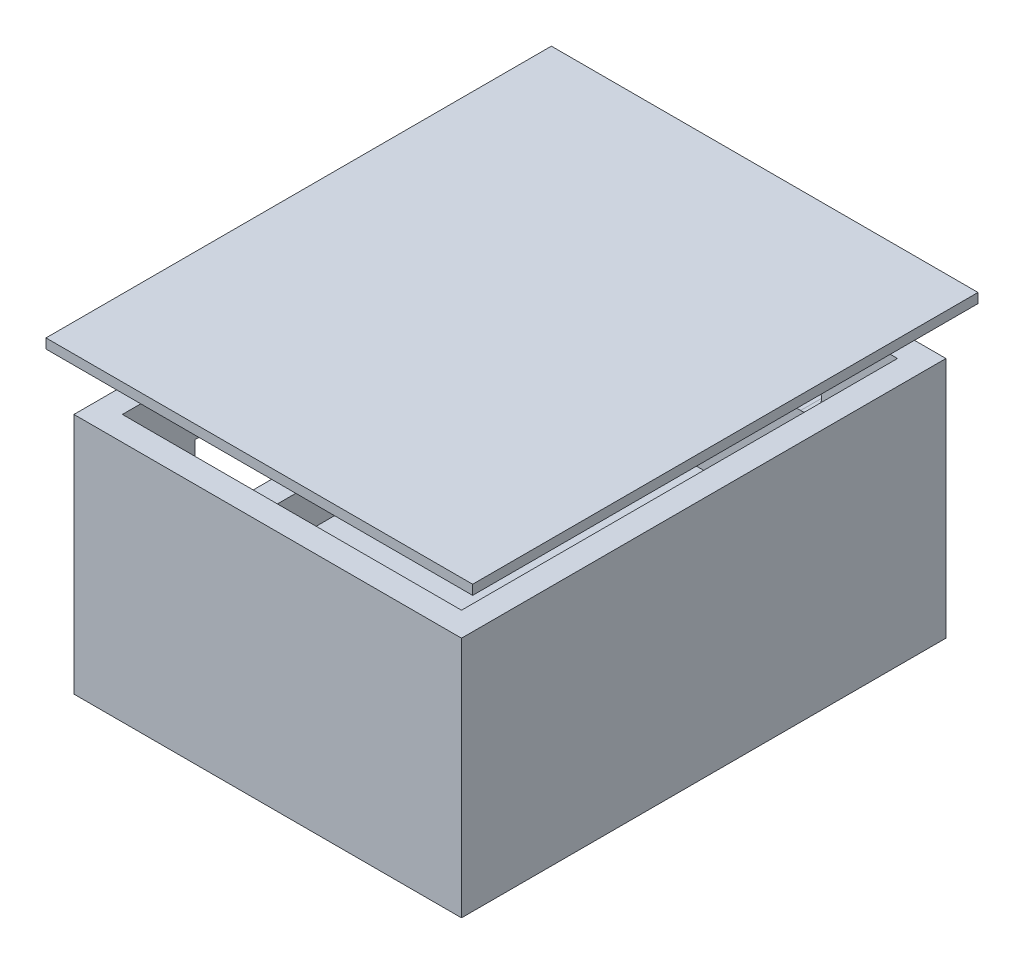
ISO-10303-21;
HEADER;
FILE_DESCRIPTION(('STEP AP214'),'2;1');
FILE_NAME('part.step','',(''),(''),'','','');
FILE_SCHEMA(('AUTOMOTIVE_DESIGN { 1 0 10303 214 1 1 1 1 }'));
ENDSEC;
DATA;
#1=APPLICATION_CONTEXT('core data for automotive mechanical design processes');
#2=APPLICATION_PROTOCOL_DEFINITION('international standard','automotive_design',2000,#1);
#3=PRODUCT_CONTEXT('',#1,'mechanical');
#4=PRODUCT('Part','Part','',(#3));
#5=PRODUCT_RELATED_PRODUCT_CATEGORY('part','',(#4));
#6=PRODUCT_DEFINITION_FORMATION('','',#4);
#7=PRODUCT_DEFINITION_CONTEXT('part definition',#1,'design');
#8=PRODUCT_DEFINITION('design','',#6,#7);
#9=PRODUCT_DEFINITION_SHAPE('','',#8);
#10=(LENGTH_UNIT() NAMED_UNIT(*) SI_UNIT(.MILLI.,.METRE.));
#11=(NAMED_UNIT(*) PLANE_ANGLE_UNIT() SI_UNIT($,.RADIAN.));
#12=(NAMED_UNIT(*) SI_UNIT($,.STERADIAN.) SOLID_ANGLE_UNIT());
#13=UNCERTAINTY_MEASURE_WITH_UNIT(LENGTH_MEASURE(1.E-05),#10,'distance_accuracy_value','');
#14=(GEOMETRIC_REPRESENTATION_CONTEXT(3) GLOBAL_UNCERTAINTY_ASSIGNED_CONTEXT((#13)) GLOBAL_UNIT_ASSIGNED_CONTEXT((#10,
#11,#12)) REPRESENTATION_CONTEXT('',''));
#15=CARTESIAN_POINT('',(0.,0.,0.));
#16=DIRECTION('',(0.,0.,1.));
#17=DIRECTION('',(1.,0.,0.));
#18=AXIS2_PLACEMENT_3D('',#15,#16,#17);
#19=CARTESIAN_POINT('',(0.,76.2,0.));
#20=DIRECTION('',(0.,-1.,0.));
#21=DIRECTION('',(0.,0.,-1.));
#22=AXIS2_PLACEMENT_3D('',#19,#20,#21);
#23=PLANE('',#22);
#24=DIRECTION('',(0.,0.,-1.));
#25=VECTOR('',#24,1.);
#26=CARTESIAN_POINT('',(106.04728817998,76.2,-130.953861718467));
#27=LINE('',#26,#25);
#28=CARTESIAN_POINT('',(106.04728817998,76.2,1.52858818137247));
#29=VERTEX_POINT('',#28);
#30=CARTESIAN_POINT('',(106.04728817998,76.2,-130.953861718467));
#31=VERTEX_POINT('',#30);
#32=EDGE_CURVE('E149',#29,#31,#27,.T.);
#33=ORIENTED_EDGE('',*,*,#32,.F.);
#34=DIRECTION('',(1.,0.,0.));
#35=VECTOR('',#34,1.);
#36=CARTESIAN_POINT('',(106.04728817998,76.2,1.52858818137247));
#37=LINE('',#36,#35);
#38=CARTESIAN_POINT('',(-5.79709493342762,76.2,1.52858818137247));
#39=VERTEX_POINT('',#38);
#40=EDGE_CURVE('E157',#39,#29,#37,.T.);
#41=ORIENTED_EDGE('',*,*,#40,.F.);
#42=DIRECTION('',(0.,0.,1.));
#43=VECTOR('',#42,1.);
#44=CARTESIAN_POINT('',(-5.79709493342762,76.2,-130.953861718467));
#45=LINE('',#44,#43);
#46=CARTESIAN_POINT('',(-5.79709493342762,76.2,-130.953861718467));
#47=VERTEX_POINT('',#46);
#48=EDGE_CURVE('E154',#47,#39,#45,.T.);
#49=ORIENTED_EDGE('',*,*,#48,.F.);
#50=DIRECTION('',(-1.,0.,0.));
#51=VECTOR('',#50,1.);
#52=CARTESIAN_POINT('',(106.04728817998,76.2,-130.953861718467));
#53=LINE('',#52,#51);
#54=EDGE_CURVE('E151',#31,#47,#53,.T.);
#55=ORIENTED_EDGE('',*,*,#54,.F.);
#56=EDGE_LOOP('',(#33,#41,#49,#55));
#57=FACE_BOUND('',#56,.T.);
#58=DIRECTION('',(0.,0.,1.));
#59=VECTOR('',#58,1.);
#60=CARTESIAN_POINT('',(99.1892881799797,76.2,-124.095861718467));
#61=LINE('',#60,#59);
#62=CARTESIAN_POINT('',(99.1892881799797,76.2,-124.095861718467));
#63=VERTEX_POINT('',#62);
#64=CARTESIAN_POINT('',(99.1892881799797,76.2,-5.32941181862753));
#65=VERTEX_POINT('',#64);
#66=EDGE_CURVE('E181',#63,#65,#61,.T.);
#67=ORIENTED_EDGE('',*,*,#66,.F.);
#68=DIRECTION('',(1.,0.,0.));
#69=VECTOR('',#68,1.);
#70=CARTESIAN_POINT('',(1.06090506657238,76.2,-124.095861718467));
#71=LINE('',#70,#69);
#72=CARTESIAN_POINT('',(1.06090506657238,76.2,-124.095861718467));
#73=VERTEX_POINT('',#72);
#74=EDGE_CURVE('E139',#73,#63,#71,.T.);
#75=ORIENTED_EDGE('',*,*,#74,.F.);
#76=DIRECTION('',(0.,0.,-1.));
#77=VECTOR('',#76,1.);
#78=CARTESIAN_POINT('',(1.06090506657238,76.2,-5.32941181862753));
#79=LINE('',#78,#77);
#80=CARTESIAN_POINT('',(1.06090506657238,76.2,-5.32941181862753));
#81=VERTEX_POINT('',#80);
#82=EDGE_CURVE('E135',#81,#73,#79,.T.);
#83=ORIENTED_EDGE('',*,*,#82,.F.);
#84=DIRECTION('',(-1.,0.,0.));
#85=VECTOR('',#84,1.);
#86=CARTESIAN_POINT('',(99.1892881799797,76.2,-5.32941181862753));
#87=LINE('',#86,#85);
#88=EDGE_CURVE('E183',#65,#81,#87,.T.);
#89=ORIENTED_EDGE('',*,*,#88,.F.);
#90=EDGE_LOOP('',(#67,#75,#83,#89));
#91=FACE_BOUND('',#90,.T.);
#92=ADVANCED_FACE('F43',(#57,#91),#23,.T.);
#93=CARTESIAN_POINT('',(106.04728817998,76.2,-130.953861718467));
#94=DIRECTION('',(1.,0.,0.));
#95=DIRECTION('',(0.,0.,-1.));
#96=AXIS2_PLACEMENT_3D('',#93,#94,#95);
#97=PLANE('',#96);
#98=DIRECTION('',(0.,0.,-1.));
#99=VECTOR('',#98,1.);
#100=CARTESIAN_POINT('',(106.04728817998,78.74,-130.953861718467));
#101=LINE('',#100,#99);
#102=CARTESIAN_POINT('',(106.04728817998,78.74,1.52858818137247));
#103=VERTEX_POINT('',#102);
#104=CARTESIAN_POINT('',(106.04728817998,78.74,-130.953861718467));
#105=VERTEX_POINT('',#104);
#106=EDGE_CURVE('E141',#103,#105,#101,.T.);
#107=ORIENTED_EDGE('',*,*,#106,.F.);
#108=DIRECTION('',(0.,1.,0.));
#109=VECTOR('',#108,1.);
#110=CARTESIAN_POINT('',(106.04728817998,76.2,1.52858818137247));
#111=LINE('',#110,#109);
#112=EDGE_CURVE('E12',#29,#103,#111,.T.);
#113=ORIENTED_EDGE('',*,*,#112,.F.);
#114=ORIENTED_EDGE('',*,*,#32,.T.);
#115=DIRECTION('',(0.,1.,0.));
#116=VECTOR('',#115,1.);
#117=CARTESIAN_POINT('',(106.04728817998,76.2,-130.953861718467));
#118=LINE('',#117,#116);
#119=EDGE_CURVE('E47',#31,#105,#118,.T.);
#120=ORIENTED_EDGE('',*,*,#119,.T.);
#121=EDGE_LOOP('',(#107,#113,#114,#120));
#122=FACE_BOUND('',#121,.T.);
#123=ADVANCED_FACE('F45',(#122),#97,.T.);
#124=CARTESIAN_POINT('',(106.04728817998,76.2,1.52858818137247));
#125=DIRECTION('',(0.,0.,1.));
#126=DIRECTION('',(1.,0.,0.));
#127=AXIS2_PLACEMENT_3D('',#124,#125,#126);
#128=PLANE('',#127);
#129=DIRECTION('',(1.,0.,0.));
#130=VECTOR('',#129,1.);
#131=CARTESIAN_POINT('',(106.04728817998,78.74,1.52858818137247));
#132=LINE('',#131,#130);
#133=CARTESIAN_POINT('',(-5.79709493342762,78.74,1.52858818137247));
#134=VERTEX_POINT('',#133);
#135=EDGE_CURVE('E152',#134,#103,#132,.T.);
#136=ORIENTED_EDGE('',*,*,#135,.F.);
#137=DIRECTION('',(0.,1.,0.));
#138=VECTOR('',#137,1.);
#139=CARTESIAN_POINT('',(-5.79709493342762,76.2,1.52858818137247));
#140=LINE('',#139,#138);
#141=EDGE_CURVE('E52',#39,#134,#140,.T.);
#142=ORIENTED_EDGE('',*,*,#141,.F.);
#143=ORIENTED_EDGE('',*,*,#40,.T.);
#144=ORIENTED_EDGE('',*,*,#112,.T.);
#145=EDGE_LOOP('',(#136,#142,#143,#144));
#146=FACE_BOUND('',#145,.T.);
#147=ADVANCED_FACE('F171',(#146),#128,.T.);
#148=CARTESIAN_POINT('',(-5.79709493342762,76.2,-130.953861718467));
#149=DIRECTION('',(-1.,0.,0.));
#150=DIRECTION('',(0.,0.,1.));
#151=AXIS2_PLACEMENT_3D('',#148,#149,#150);
#152=PLANE('',#151);
#153=DIRECTION('',(0.,0.,1.));
#154=VECTOR('',#153,1.);
#155=CARTESIAN_POINT('',(-5.79709493342762,78.74,-130.953861718467));
#156=LINE('',#155,#154);
#157=CARTESIAN_POINT('',(-5.79709493342762,78.74,-130.953861718467));
#158=VERTEX_POINT('',#157);
#159=EDGE_CURVE('E161',#158,#134,#156,.T.);
#160=ORIENTED_EDGE('',*,*,#159,.F.);
#161=DIRECTION('',(0.,1.,0.));
#162=VECTOR('',#161,1.);
#163=CARTESIAN_POINT('',(-5.79709493342762,76.2,-130.953861718467));
#164=LINE('',#163,#162);
#165=EDGE_CURVE('E166',#47,#158,#164,.T.);
#166=ORIENTED_EDGE('',*,*,#165,.F.);
#167=ORIENTED_EDGE('',*,*,#48,.T.);
#168=ORIENTED_EDGE('',*,*,#141,.T.);
#169=EDGE_LOOP('',(#160,#166,#167,#168));
#170=FACE_BOUND('',#169,.T.);
#171=ADVANCED_FACE('F175',(#170),#152,.T.);
#172=CARTESIAN_POINT('',(106.04728817998,76.2,-130.953861718467));
#173=DIRECTION('',(0.,0.,-1.));
#174=DIRECTION('',(-1.,0.,0.));
#175=AXIS2_PLACEMENT_3D('',#172,#173,#174);
#176=PLANE('',#175);
#177=DIRECTION('',(-1.,0.,0.));
#178=VECTOR('',#177,1.);
#179=CARTESIAN_POINT('',(106.04728817998,78.74,-130.953861718467));
#180=LINE('',#179,#178);
#181=EDGE_CURVE('E144',#105,#158,#180,.T.);
#182=ORIENTED_EDGE('',*,*,#181,.F.);
#183=ORIENTED_EDGE('',*,*,#119,.F.);
#184=ORIENTED_EDGE('',*,*,#54,.T.);
#185=ORIENTED_EDGE('',*,*,#165,.T.);
#186=EDGE_LOOP('',(#182,#183,#184,#185));
#187=FACE_BOUND('',#186,.T.);
#188=ADVANCED_FACE('F168',(#187),#176,.T.);
#189=CARTESIAN_POINT('',(0.,78.74,0.));
#190=DIRECTION('',(0.,-1.,0.));
#191=DIRECTION('',(0.,0.,-1.));
#192=AXIS2_PLACEMENT_3D('',#189,#190,#191);
#193=PLANE('',#192);
#194=ORIENTED_EDGE('',*,*,#106,.T.);
#195=ORIENTED_EDGE('',*,*,#181,.T.);
#196=ORIENTED_EDGE('',*,*,#159,.T.);
#197=ORIENTED_EDGE('',*,*,#135,.T.);
#198=EDGE_LOOP('',(#194,#195,#196,#197));
#199=FACE_BOUND('',#198,.T.);
#200=ADVANCED_FACE('F170',(#199),#193,.F.);
#201=CARTESIAN_POINT('',(1.06090506657238,73.66,-124.095861718467));
#202=DIRECTION('',(0.,0.,1.));
#203=DIRECTION('',(1.,0.,0.));
#204=AXIS2_PLACEMENT_3D('',#201,#202,#203);
#205=PLANE('',#204);
#206=ORIENTED_EDGE('',*,*,#74,.T.);
#207=DIRECTION('',(0.,1.,0.));
#208=VECTOR('',#207,1.);
#209=CARTESIAN_POINT('',(99.1892881799797,73.66,-124.095861718467));
#210=LINE('',#209,#208);
#211=CARTESIAN_POINT('',(99.1892881799797,73.66,-124.095861718467));
#212=VERTEX_POINT('',#211);
#213=EDGE_CURVE('E120',#212,#63,#210,.T.);
#214=ORIENTED_EDGE('',*,*,#213,.F.);
#215=DIRECTION('',(1.,0.,0.));
#216=VECTOR('',#215,1.);
#217=CARTESIAN_POINT('',(1.06090506657238,73.66,-124.095861718467));
#218=LINE('',#217,#216);
#219=CARTESIAN_POINT('',(1.06090506657238,73.66,-124.095861718467));
#220=VERTEX_POINT('',#219);
#221=EDGE_CURVE('E127',#220,#212,#218,.T.);
#222=ORIENTED_EDGE('',*,*,#221,.F.);
#223=DIRECTION('',(0.,1.,0.));
#224=VECTOR('',#223,1.);
#225=CARTESIAN_POINT('',(1.06090506657238,73.66,-124.095861718467));
#226=LINE('',#225,#224);
#227=EDGE_CURVE('E190',#220,#73,#226,.T.);
#228=ORIENTED_EDGE('',*,*,#227,.T.);
#229=EDGE_LOOP('',(#206,#214,#222,#228));
#230=FACE_BOUND('',#229,.T.);
#231=ADVANCED_FACE('F137',(#230),#205,.F.);
#232=CARTESIAN_POINT('',(99.1892881799797,73.66,-124.095861718467));
#233=DIRECTION('',(-1.,0.,0.));
#234=DIRECTION('',(0.,0.,1.));
#235=AXIS2_PLACEMENT_3D('',#232,#233,#234);
#236=PLANE('',#235);
#237=ORIENTED_EDGE('',*,*,#66,.T.);
#238=DIRECTION('',(0.,1.,0.));
#239=VECTOR('',#238,1.);
#240=CARTESIAN_POINT('',(99.1892881799797,73.66,-5.32941181862753));
#241=LINE('',#240,#239);
#242=CARTESIAN_POINT('',(99.1892881799797,73.66,-5.32941181862753));
#243=VERTEX_POINT('',#242);
#244=EDGE_CURVE('E123',#243,#65,#241,.T.);
#245=ORIENTED_EDGE('',*,*,#244,.F.);
#246=DIRECTION('',(0.,0.,1.));
#247=VECTOR('',#246,1.);
#248=CARTESIAN_POINT('',(99.1892881799797,73.66,-124.095861718467));
#249=LINE('',#248,#247);
#250=EDGE_CURVE('E116',#212,#243,#249,.T.);
#251=ORIENTED_EDGE('',*,*,#250,.F.);
#252=ORIENTED_EDGE('',*,*,#213,.T.);
#253=EDGE_LOOP('',(#237,#245,#251,#252));
#254=FACE_BOUND('',#253,.T.);
#255=ADVANCED_FACE('F118',(#254),#236,.F.);
#256=CARTESIAN_POINT('',(99.1892881799797,73.66,-5.32941181862753));
#257=DIRECTION('',(0.,0.,-1.));
#258=DIRECTION('',(-1.,0.,0.));
#259=AXIS2_PLACEMENT_3D('',#256,#257,#258);
#260=PLANE('',#259);
#261=ORIENTED_EDGE('',*,*,#88,.T.);
#262=DIRECTION('',(0.,1.,0.));
#263=VECTOR('',#262,1.);
#264=CARTESIAN_POINT('',(1.06090506657238,73.66,-5.32941181862753));
#265=LINE('',#264,#263);
#266=CARTESIAN_POINT('',(1.06090506657238,73.66,-5.32941181862753));
#267=VERTEX_POINT('',#266);
#268=EDGE_CURVE('E60',#267,#81,#265,.T.);
#269=ORIENTED_EDGE('',*,*,#268,.F.);
#270=DIRECTION('',(-1.,0.,0.));
#271=VECTOR('',#270,1.);
#272=CARTESIAN_POINT('',(99.1892881799797,73.66,-5.32941181862753));
#273=LINE('',#272,#271);
#274=EDGE_CURVE('E126',#243,#267,#273,.T.);
#275=ORIENTED_EDGE('',*,*,#274,.F.);
#276=ORIENTED_EDGE('',*,*,#244,.T.);
#277=EDGE_LOOP('',(#261,#269,#275,#276));
#278=FACE_BOUND('',#277,.T.);
#279=ADVANCED_FACE('F193',(#278),#260,.F.);
#280=CARTESIAN_POINT('',(1.06090506657238,73.66,-5.32941181862753));
#281=DIRECTION('',(1.,0.,0.));
#282=DIRECTION('',(0.,0.,-1.));
#283=AXIS2_PLACEMENT_3D('',#280,#281,#282);
#284=PLANE('',#283);
#285=ORIENTED_EDGE('',*,*,#82,.T.);
#286=ORIENTED_EDGE('',*,*,#227,.F.);
#287=DIRECTION('',(0.,0.,-1.));
#288=VECTOR('',#287,1.);
#289=CARTESIAN_POINT('',(1.06090506657238,73.66,-5.32941181862753));
#290=LINE('',#289,#288);
#291=EDGE_CURVE('E131',#267,#220,#290,.T.);
#292=ORIENTED_EDGE('',*,*,#291,.F.);
#293=ORIENTED_EDGE('',*,*,#268,.T.);
#294=EDGE_LOOP('',(#285,#286,#292,#293));
#295=FACE_BOUND('',#294,.T.);
#296=ADVANCED_FACE('F194',(#295),#284,.F.);
#297=CARTESIAN_POINT('',(0.,73.66,0.));
#298=DIRECTION('',(0.,-1.,0.));
#299=DIRECTION('',(0.,0.,-1.));
#300=AXIS2_PLACEMENT_3D('',#297,#298,#299);
#301=PLANE('',#300);
#302=ORIENTED_EDGE('',*,*,#221,.T.);
#303=ORIENTED_EDGE('',*,*,#250,.T.);
#304=ORIENTED_EDGE('',*,*,#274,.T.);
#305=ORIENTED_EDGE('',*,*,#291,.T.);
#306=EDGE_LOOP('',(#302,#303,#304,#305));
#307=FACE_BOUND('',#306,.T.);
#308=ADVANCED_FACE('F130',(#307),#301,.T.);
#309=CLOSED_SHELL('',(#92,#123,#147,#171,#188,#200,#231,#255,#279,#296,#308));
#310=MANIFOLD_SOLID_BREP('B2',#309);
#311=CARTESIAN_POINT('',(0.,63.5,0.));
#312=DIRECTION('',(1.,0.,0.));
#313=DIRECTION('',(0.,0.,-1.));
#314=AXIS2_PLACEMENT_3D('',#311,#312,#313);
#315=PLANE('',#314);
#316=DIRECTION('',(0.,0.,-1.));
#317=VECTOR('',#316,1.);
#318=CARTESIAN_POINT('',(0.,48.26,-101.6));
#319=LINE('',#318,#317);
#320=CARTESIAN_POINT('',(0.,48.26,-25.4));
#321=VERTEX_POINT('',#320);
#322=CARTESIAN_POINT('',(0.,48.26,-101.6));
#323=VERTEX_POINT('',#322);
#324=EDGE_CURVE('E424',#321,#323,#319,.T.);
#325=ORIENTED_EDGE('',*,*,#324,.F.);
#326=DIRECTION('',(0.,1.,0.));
#327=VECTOR('',#326,1.);
#328=CARTESIAN_POINT('',(0.,48.26,-25.4));
#329=LINE('',#328,#327);
#330=CARTESIAN_POINT('',(0.,22.86,-25.4));
#331=VERTEX_POINT('',#330);
#332=EDGE_CURVE('E420',#331,#321,#329,.T.);
#333=ORIENTED_EDGE('',*,*,#332,.F.);
#334=DIRECTION('',(0.,0.,1.));
#335=VECTOR('',#334,1.);
#336=CARTESIAN_POINT('',(0.,22.86,-25.4));
#337=LINE('',#336,#335);
#338=CARTESIAN_POINT('',(0.,22.86,-101.6));
#339=VERTEX_POINT('',#338);
#340=EDGE_CURVE('E430',#339,#331,#337,.T.);
#341=ORIENTED_EDGE('',*,*,#340,.F.);
#342=DIRECTION('',(0.,-1.,0.));
#343=VECTOR('',#342,1.);
#344=CARTESIAN_POINT('',(0.,48.26,-101.6));
#345=LINE('',#344,#343);
#346=EDGE_CURVE('E427',#323,#339,#345,.T.);
#347=ORIENTED_EDGE('',*,*,#346,.F.);
#348=EDGE_LOOP('',(#325,#333,#341,#347));
#349=FACE_BOUND('',#348,.T.);
#350=DIRECTION('',(0.,0.,1.));
#351=VECTOR('',#350,1.);
#352=CARTESIAN_POINT('',(0.,0.,0.));
#353=LINE('',#352,#351);
#354=CARTESIAN_POINT('',(0.,0.,-127.));
#355=VERTEX_POINT('',#354);
#356=CARTESIAN_POINT('',(0.,0.,0.));
#357=VERTEX_POINT('',#356);
#358=EDGE_CURVE('E468',#355,#357,#353,.T.);
#359=ORIENTED_EDGE('',*,*,#358,.T.);
#360=DIRECTION('',(0.,-1.,0.));
#361=VECTOR('',#360,1.);
#362=CARTESIAN_POINT('',(0.,63.5,0.));
#363=LINE('',#362,#361);
#364=CARTESIAN_POINT('',(0.,63.5,0.));
#365=VERTEX_POINT('',#364);
#366=EDGE_CURVE('E501',#365,#357,#363,.T.);
#367=ORIENTED_EDGE('',*,*,#366,.F.);
#368=DIRECTION('',(0.,0.,1.));
#369=VECTOR('',#368,1.);
#370=CARTESIAN_POINT('',(0.,63.5,0.));
#371=LINE('',#370,#369);
#372=CARTESIAN_POINT('',(0.,63.5,-127.));
#373=VERTEX_POINT('',#372);
#374=EDGE_CURVE('E475',#373,#365,#371,.T.);
#375=ORIENTED_EDGE('',*,*,#374,.F.);
#376=DIRECTION('',(0.,-1.,0.));
#377=VECTOR('',#376,1.);
#378=CARTESIAN_POINT('',(0.,63.5,-127.));
#379=LINE('',#378,#377);
#380=EDGE_CURVE('E485',#373,#355,#379,.T.);
#381=ORIENTED_EDGE('',*,*,#380,.T.);
#382=EDGE_LOOP('',(#359,#367,#375,#381));
#383=FACE_BOUND('',#382,.T.);
#384=ADVANCED_FACE('F282',(#349,#383),#315,.F.);
#385=CARTESIAN_POINT('',(0.,63.5,0.));
#386=DIRECTION('',(0.,0.,-1.));
#387=DIRECTION('',(-1.,0.,0.));
#388=AXIS2_PLACEMENT_3D('',#385,#386,#387);
#389=PLANE('',#388);
#390=DIRECTION('',(1.,0.,0.));
#391=VECTOR('',#390,1.);
#392=CARTESIAN_POINT('',(0.,0.,0.));
#393=LINE('',#392,#391);
#394=CARTESIAN_POINT('',(101.6,0.,0.));
#395=VERTEX_POINT('',#394);
#396=EDGE_CURVE('E488',#357,#395,#393,.T.);
#397=ORIENTED_EDGE('',*,*,#396,.T.);
#398=DIRECTION('',(0.,-1.,0.));
#399=VECTOR('',#398,1.);
#400=CARTESIAN_POINT('',(101.6,63.5,0.));
#401=LINE('',#400,#399);
#402=CARTESIAN_POINT('',(101.6,63.5,0.));
#403=VERTEX_POINT('',#402);
#404=EDGE_CURVE('E498',#403,#395,#401,.T.);
#405=ORIENTED_EDGE('',*,*,#404,.F.);
#406=DIRECTION('',(1.,0.,0.));
#407=VECTOR('',#406,1.);
#408=CARTESIAN_POINT('',(0.,63.5,0.));
#409=LINE('',#408,#407);
#410=EDGE_CURVE('E478',#365,#403,#409,.T.);
#411=ORIENTED_EDGE('',*,*,#410,.F.);
#412=ORIENTED_EDGE('',*,*,#366,.T.);
#413=EDGE_LOOP('',(#397,#405,#411,#412));
#414=FACE_BOUND('',#413,.T.);
#415=ADVANCED_FACE('F540',(#414),#389,.F.);
#416=CARTESIAN_POINT('',(101.6,63.5,0.));
#417=DIRECTION('',(-1.,0.,0.));
#418=DIRECTION('',(0.,0.,1.));
#419=AXIS2_PLACEMENT_3D('',#416,#417,#418);
#420=PLANE('',#419);
#421=DIRECTION('',(0.,0.,-1.));
#422=VECTOR('',#421,1.);
#423=CARTESIAN_POINT('',(101.6,0.,0.));
#424=LINE('',#423,#422);
#425=CARTESIAN_POINT('',(101.6,0.,-127.));
#426=VERTEX_POINT('',#425);
#427=EDGE_CURVE('E490',#395,#426,#424,.T.);
#428=ORIENTED_EDGE('',*,*,#427,.T.);
#429=DIRECTION('',(0.,-1.,0.));
#430=VECTOR('',#429,1.);
#431=CARTESIAN_POINT('',(101.6,63.5,-127.));
#432=LINE('',#431,#430);
#433=CARTESIAN_POINT('',(101.6,63.5,-127.));
#434=VERTEX_POINT('',#433);
#435=EDGE_CURVE('E495',#434,#426,#432,.T.);
#436=ORIENTED_EDGE('',*,*,#435,.F.);
#437=DIRECTION('',(0.,0.,-1.));
#438=VECTOR('',#437,1.);
#439=CARTESIAN_POINT('',(101.6,63.5,0.));
#440=LINE('',#439,#438);
#441=EDGE_CURVE('E481',#403,#434,#440,.T.);
#442=ORIENTED_EDGE('',*,*,#441,.F.);
#443=ORIENTED_EDGE('',*,*,#404,.T.);
#444=EDGE_LOOP('',(#428,#436,#442,#443));
#445=FACE_BOUND('',#444,.T.);
#446=ADVANCED_FACE('F545',(#445),#420,.F.);
#447=CARTESIAN_POINT('',(0.,63.5,-127.));
#448=DIRECTION('',(0.,0.,1.));
#449=DIRECTION('',(1.,0.,0.));
#450=AXIS2_PLACEMENT_3D('',#447,#448,#449);
#451=PLANE('',#450);
#452=DIRECTION('',(1.,0.,0.));
#453=VECTOR('',#452,1.);
#454=CARTESIAN_POINT('',(31.75,49.8970006054869,-127.));
#455=LINE('',#454,#453);
#456=CARTESIAN_POINT('',(31.75,49.8970006054869,-127.));
#457=VERTEX_POINT('',#456);
#458=CARTESIAN_POINT('',(69.85,49.8970006054869,-127.));
#459=VERTEX_POINT('',#458);
#460=EDGE_CURVE('E406',#457,#459,#455,.T.);
#461=ORIENTED_EDGE('',*,*,#460,.F.);
#462=CARTESIAN_POINT('',(31.75,44.45,-127.));
#463=DIRECTION('',(0.,0.,-1.));
#464=DIRECTION('',(-1.,0.,0.));
#465=AXIS2_PLACEMENT_3D('',#462,#463,#464);
#466=CIRCLE('',#465,5.44700060548685);
#467=CARTESIAN_POINT('',(31.75,39.0029993945132,-127.));
#468=VERTEX_POINT('',#467);
#469=EDGE_CURVE('E296',#468,#457,#466,.T.);
#470=ORIENTED_EDGE('',*,*,#469,.F.);
#471=DIRECTION('',(-1.,0.,0.));
#472=VECTOR('',#471,1.);
#473=CARTESIAN_POINT('',(31.75,39.0029993945132,-127.));
#474=LINE('',#473,#472);
#475=CARTESIAN_POINT('',(69.85,39.0029993945132,-127.));
#476=VERTEX_POINT('',#475);
#477=EDGE_CURVE('E413',#476,#468,#474,.T.);
#478=ORIENTED_EDGE('',*,*,#477,.F.);
#479=CARTESIAN_POINT('',(69.85,44.45,-127.));
#480=DIRECTION('',(0.,0.,-1.));
#481=DIRECTION('',(-1.,0.,0.));
#482=AXIS2_PLACEMENT_3D('',#479,#480,#481);
#483=CIRCLE('',#482,5.44700060548685);
#484=EDGE_CURVE('E397',#459,#476,#483,.T.);
#485=ORIENTED_EDGE('',*,*,#484,.F.);
#486=EDGE_LOOP('',(#461,#470,#478,#485));
#487=FACE_BOUND('',#486,.T.);
#488=DIRECTION('',(-1.,0.,0.));
#489=VECTOR('',#488,1.);
#490=CARTESIAN_POINT('',(0.,0.,-127.));
#491=LINE('',#490,#489);
#492=EDGE_CURVE('E479',#426,#355,#491,.T.);
#493=ORIENTED_EDGE('',*,*,#492,.T.);
#494=ORIENTED_EDGE('',*,*,#380,.F.);
#495=DIRECTION('',(-1.,0.,0.));
#496=VECTOR('',#495,1.);
#497=CARTESIAN_POINT('',(0.,63.5,-127.));
#498=LINE('',#497,#496);
#499=EDGE_CURVE('E483',#434,#373,#498,.T.);
#500=ORIENTED_EDGE('',*,*,#499,.F.);
#501=ORIENTED_EDGE('',*,*,#435,.T.);
#502=EDGE_LOOP('',(#493,#494,#500,#501));
#503=FACE_BOUND('',#502,.T.);
#504=ADVANCED_FACE('F410',(#487,#503),#451,.F.);
#505=CARTESIAN_POINT('',(0.,63.5,0.));
#506=DIRECTION('',(0.,-1.,0.));
#507=DIRECTION('',(0.,0.,-1.));
#508=AXIS2_PLACEMENT_3D('',#505,#506,#507);
#509=PLANE('',#508);
#510=DIRECTION('',(0.,0.,1.));
#511=VECTOR('',#510,1.);
#512=CARTESIAN_POINT('',(6.35,63.5,-120.65));
#513=LINE('',#512,#511);
#514=CARTESIAN_POINT('',(6.35,63.5,-120.65));
#515=VERTEX_POINT('',#514);
#516=CARTESIAN_POINT('',(6.35,63.5,-6.35));
#517=VERTEX_POINT('',#516);
#518=EDGE_CURVE('E458',#515,#517,#513,.T.);
#519=ORIENTED_EDGE('',*,*,#518,.F.);
#520=DIRECTION('',(-1.,0.,0.));
#521=VECTOR('',#520,1.);
#522=CARTESIAN_POINT('',(95.25,63.5,-120.65));
#523=LINE('',#522,#521);
#524=CARTESIAN_POINT('',(95.25,63.5,-120.65));
#525=VERTEX_POINT('',#524);
#526=EDGE_CURVE('E436',#525,#515,#523,.T.);
#527=ORIENTED_EDGE('',*,*,#526,.F.);
#528=DIRECTION('',(0.,0.,-1.));
#529=VECTOR('',#528,1.);
#530=CARTESIAN_POINT('',(95.25,63.5,-6.35));
#531=LINE('',#530,#529);
#532=CARTESIAN_POINT('',(95.25,63.5,-6.35));
#533=VERTEX_POINT('',#532);
#534=EDGE_CURVE('E447',#533,#525,#531,.T.);
#535=ORIENTED_EDGE('',*,*,#534,.F.);
#536=DIRECTION('',(1.,0.,0.));
#537=VECTOR('',#536,1.);
#538=CARTESIAN_POINT('',(6.35,63.5,-6.35));
#539=LINE('',#538,#537);
#540=EDGE_CURVE('E461',#517,#533,#539,.T.);
#541=ORIENTED_EDGE('',*,*,#540,.F.);
#542=EDGE_LOOP('',(#519,#527,#535,#541));
#543=FACE_BOUND('',#542,.T.);
#544=ORIENTED_EDGE('',*,*,#374,.T.);
#545=ORIENTED_EDGE('',*,*,#410,.T.);
#546=ORIENTED_EDGE('',*,*,#441,.T.);
#547=ORIENTED_EDGE('',*,*,#499,.T.);
#548=EDGE_LOOP('',(#544,#545,#546,#547));
#549=FACE_BOUND('',#548,.T.);
#550=ADVANCED_FACE('F562',(#543,#549),#509,.F.);
#551=CARTESIAN_POINT('',(0.,0.,0.));
#552=DIRECTION('',(0.,-1.,0.));
#553=DIRECTION('',(0.,0.,-1.));
#554=AXIS2_PLACEMENT_3D('',#551,#552,#553);
#555=PLANE('',#554);
#556=ORIENTED_EDGE('',*,*,#358,.F.);
#557=ORIENTED_EDGE('',*,*,#492,.F.);
#558=ORIENTED_EDGE('',*,*,#427,.F.);
#559=ORIENTED_EDGE('',*,*,#396,.F.);
#560=EDGE_LOOP('',(#556,#557,#558,#559));
#561=FACE_BOUND('',#560,.T.);
#562=ADVANCED_FACE('F557',(#561),#555,.T.);
#563=CARTESIAN_POINT('',(95.25,12.7,-120.65));
#564=DIRECTION('',(0.,0.,-1.));
#565=DIRECTION('',(-1.,0.,0.));
#566=AXIS2_PLACEMENT_3D('',#563,#564,#565);
#567=PLANE('',#566);
#568=DIRECTION('',(-1.,0.,0.));
#569=VECTOR('',#568,1.);
#570=CARTESIAN_POINT('',(95.25,39.0029993945132,-120.65));
#571=LINE('',#570,#569);
#572=CARTESIAN_POINT('',(69.85,39.0029993945132,-120.65));
#573=VERTEX_POINT('',#572);
#574=CARTESIAN_POINT('',(31.75,39.0029993945132,-120.65));
#575=VERTEX_POINT('',#574);
#576=EDGE_CURVE('E289',#573,#575,#571,.T.);
#577=ORIENTED_EDGE('',*,*,#576,.T.);
#578=CARTESIAN_POINT('',(31.75,44.45,-120.65));
#579=DIRECTION('',(0.,0.,-1.));
#580=DIRECTION('',(-1.,0.,0.));
#581=AXIS2_PLACEMENT_3D('',#578,#579,#580);
#582=CIRCLE('',#581,5.44700060548685);
#583=CARTESIAN_POINT('',(31.75,49.8970006054869,-120.65));
#584=VERTEX_POINT('',#583);
#585=EDGE_CURVE('E41',#575,#584,#582,.T.);
#586=ORIENTED_EDGE('',*,*,#585,.T.);
#587=DIRECTION('',(1.,0.,0.));
#588=VECTOR('',#587,1.);
#589=CARTESIAN_POINT('',(95.25,49.8970006054869,-120.65));
#590=LINE('',#589,#588);
#591=CARTESIAN_POINT('',(69.85,49.8970006054869,-120.65));
#592=VERTEX_POINT('',#591);
#593=EDGE_CURVE('E516',#584,#592,#590,.T.);
#594=ORIENTED_EDGE('',*,*,#593,.T.);
#595=CARTESIAN_POINT('',(69.85,44.45,-120.65));
#596=DIRECTION('',(0.,0.,-1.));
#597=DIRECTION('',(-1.,0.,0.));
#598=AXIS2_PLACEMENT_3D('',#595,#596,#597);
#599=CIRCLE('',#598,5.44700060548685);
#600=EDGE_CURVE('E400',#592,#573,#599,.T.);
#601=ORIENTED_EDGE('',*,*,#600,.T.);
#602=EDGE_LOOP('',(#577,#586,#594,#601));
#603=FACE_BOUND('',#602,.T.);
#604=ORIENTED_EDGE('',*,*,#526,.T.);
#605=DIRECTION('',(0.,1.,0.));
#606=VECTOR('',#605,1.);
#607=CARTESIAN_POINT('',(6.35,12.7,-120.65));
#608=LINE('',#607,#606);
#609=CARTESIAN_POINT('',(6.35,12.7,-120.65));
#610=VERTEX_POINT('',#609);
#611=EDGE_CURVE('E456',#610,#515,#608,.T.);
#612=ORIENTED_EDGE('',*,*,#611,.F.);
#613=DIRECTION('',(-1.,0.,0.));
#614=VECTOR('',#613,1.);
#615=CARTESIAN_POINT('',(95.25,12.7,-120.65));
#616=LINE('',#615,#614);
#617=CARTESIAN_POINT('',(95.25,12.7,-120.65));
#618=VERTEX_POINT('',#617);
#619=EDGE_CURVE('E443',#618,#610,#616,.T.);
#620=ORIENTED_EDGE('',*,*,#619,.F.);
#621=DIRECTION('',(0.,1.,0.));
#622=VECTOR('',#621,1.);
#623=CARTESIAN_POINT('',(95.25,12.7,-120.65));
#624=LINE('',#623,#622);
#625=EDGE_CURVE('E466',#618,#525,#624,.T.);
#626=ORIENTED_EDGE('',*,*,#625,.T.);
#627=EDGE_LOOP('',(#604,#612,#620,#626));
#628=FACE_BOUND('',#627,.T.);
#629=ADVANCED_FACE('F520',(#603,#628),#567,.F.);
#630=CARTESIAN_POINT('',(95.25,12.7,-6.35));
#631=DIRECTION('',(1.,0.,0.));
#632=DIRECTION('',(0.,0.,-1.));
#633=AXIS2_PLACEMENT_3D('',#630,#631,#632);
#634=PLANE('',#633);
#635=ORIENTED_EDGE('',*,*,#534,.T.);
#636=ORIENTED_EDGE('',*,*,#625,.F.);
#637=DIRECTION('',(0.,0.,-1.));
#638=VECTOR('',#637,1.);
#639=CARTESIAN_POINT('',(95.25,12.7,-6.35));
#640=LINE('',#639,#638);
#641=CARTESIAN_POINT('',(95.25,12.7,-6.35));
#642=VERTEX_POINT('',#641);
#643=EDGE_CURVE('E453',#642,#618,#640,.T.);
#644=ORIENTED_EDGE('',*,*,#643,.F.);
#645=DIRECTION('',(0.,1.,0.));
#646=VECTOR('',#645,1.);
#647=CARTESIAN_POINT('',(95.25,12.7,-6.35));
#648=LINE('',#647,#646);
#649=EDGE_CURVE('E469',#642,#533,#648,.T.);
#650=ORIENTED_EDGE('',*,*,#649,.T.);
#651=EDGE_LOOP('',(#635,#636,#644,#650));
#652=FACE_BOUND('',#651,.T.);
#653=ADVANCED_FACE('F580',(#652),#634,.F.);
#654=CARTESIAN_POINT('',(6.35,12.7,-6.35));
#655=DIRECTION('',(0.,0.,1.));
#656=DIRECTION('',(1.,0.,0.));
#657=AXIS2_PLACEMENT_3D('',#654,#655,#656);
#658=PLANE('',#657);
#659=ORIENTED_EDGE('',*,*,#540,.T.);
#660=ORIENTED_EDGE('',*,*,#649,.F.);
#661=DIRECTION('',(1.,0.,0.));
#662=VECTOR('',#661,1.);
#663=CARTESIAN_POINT('',(6.35,12.7,-6.35));
#664=LINE('',#663,#662);
#665=CARTESIAN_POINT('',(6.35,12.7,-6.35));
#666=VERTEX_POINT('',#665);
#667=EDGE_CURVE('E450',#666,#642,#664,.T.);
#668=ORIENTED_EDGE('',*,*,#667,.F.);
#669=DIRECTION('',(0.,1.,0.));
#670=VECTOR('',#669,1.);
#671=CARTESIAN_POINT('',(6.35,12.7,-6.35));
#672=LINE('',#671,#670);
#673=EDGE_CURVE('E471',#666,#517,#672,.T.);
#674=ORIENTED_EDGE('',*,*,#673,.T.);
#675=EDGE_LOOP('',(#659,#660,#668,#674));
#676=FACE_BOUND('',#675,.T.);
#677=ADVANCED_FACE('F585',(#676),#658,.F.);
#678=CARTESIAN_POINT('',(6.35,12.7,-120.65));
#679=DIRECTION('',(-1.,0.,0.));
#680=DIRECTION('',(0.,0.,1.));
#681=AXIS2_PLACEMENT_3D('',#678,#679,#680);
#682=PLANE('',#681);
#683=DIRECTION('',(0.,0.,1.));
#684=VECTOR('',#683,1.);
#685=CARTESIAN_POINT('',(6.35,22.86,-120.65));
#686=LINE('',#685,#684);
#687=CARTESIAN_POINT('',(6.35,22.86,-101.6));
#688=VERTEX_POINT('',#687);
#689=CARTESIAN_POINT('',(6.35,22.86,-25.4));
#690=VERTEX_POINT('',#689);
#691=EDGE_CURVE('E510',#688,#690,#686,.T.);
#692=ORIENTED_EDGE('',*,*,#691,.T.);
#693=DIRECTION('',(0.,1.,0.));
#694=VECTOR('',#693,1.);
#695=CARTESIAN_POINT('',(6.35,12.7,-25.4));
#696=LINE('',#695,#694);
#697=CARTESIAN_POINT('',(6.35,48.26,-25.4));
#698=VERTEX_POINT('',#697);
#699=EDGE_CURVE('E513',#690,#698,#696,.T.);
#700=ORIENTED_EDGE('',*,*,#699,.T.);
#701=DIRECTION('',(0.,0.,-1.));
#702=VECTOR('',#701,1.);
#703=CARTESIAN_POINT('',(6.35,48.26,-120.65));
#704=LINE('',#703,#702);
#705=CARTESIAN_POINT('',(6.35,48.26,-101.6));
#706=VERTEX_POINT('',#705);
#707=EDGE_CURVE('E504',#698,#706,#704,.T.);
#708=ORIENTED_EDGE('',*,*,#707,.T.);
#709=DIRECTION('',(0.,-1.,0.));
#710=VECTOR('',#709,1.);
#711=CARTESIAN_POINT('',(6.35,12.7,-101.6));
#712=LINE('',#711,#710);
#713=EDGE_CURVE('E507',#706,#688,#712,.T.);
#714=ORIENTED_EDGE('',*,*,#713,.T.);
#715=EDGE_LOOP('',(#692,#700,#708,#714));
#716=FACE_BOUND('',#715,.T.);
#717=ORIENTED_EDGE('',*,*,#518,.T.);
#718=ORIENTED_EDGE('',*,*,#673,.F.);
#719=DIRECTION('',(0.,0.,1.));
#720=VECTOR('',#719,1.);
#721=CARTESIAN_POINT('',(6.35,12.7,-120.65));
#722=LINE('',#721,#720);
#723=EDGE_CURVE('E446',#610,#666,#722,.T.);
#724=ORIENTED_EDGE('',*,*,#723,.F.);
#725=ORIENTED_EDGE('',*,*,#611,.T.);
#726=EDGE_LOOP('',(#717,#718,#724,#725));
#727=FACE_BOUND('',#726,.T.);
#728=ADVANCED_FACE('F581',(#716,#727),#682,.F.);
#729=CARTESIAN_POINT('',(0.,12.7,0.));
#730=DIRECTION('',(0.,1.,0.));
#731=DIRECTION('',(0.,0.,1.));
#732=AXIS2_PLACEMENT_3D('',#729,#730,#731);
#733=PLANE('',#732);
#734=ORIENTED_EDGE('',*,*,#619,.T.);
#735=ORIENTED_EDGE('',*,*,#723,.T.);
#736=ORIENTED_EDGE('',*,*,#667,.T.);
#737=ORIENTED_EDGE('',*,*,#643,.T.);
#738=EDGE_LOOP('',(#734,#735,#736,#737));
#739=FACE_BOUND('',#738,.T.);
#740=ADVANCED_FACE('F584',(#739),#733,.T.);
#741=CARTESIAN_POINT('',(50.8,48.26,-25.4));
#742=DIRECTION('',(0.,0.,1.));
#743=DIRECTION('',(0.,-1.,0.));
#744=AXIS2_PLACEMENT_3D('',#741,#742,#743);
#745=PLANE('',#744);
#746=DIRECTION('',(-1.,0.,0.));
#747=VECTOR('',#746,1.);
#748=CARTESIAN_POINT('',(50.8,22.86,-25.4));
#749=LINE('',#748,#747);
#750=EDGE_CURVE('E434',#690,#331,#749,.T.);
#751=ORIENTED_EDGE('',*,*,#750,.T.);
#752=ORIENTED_EDGE('',*,*,#332,.T.);
#753=DIRECTION('',(-1.,0.,0.));
#754=VECTOR('',#753,1.);
#755=CARTESIAN_POINT('',(50.8,48.26,-25.4));
#756=LINE('',#755,#754);
#757=EDGE_CURVE('E433',#698,#321,#756,.T.);
#758=ORIENTED_EDGE('',*,*,#757,.F.);
#759=ORIENTED_EDGE('',*,*,#699,.F.);
#760=EDGE_LOOP('',(#751,#752,#758,#759));
#761=FACE_BOUND('',#760,.T.);
#762=ADVANCED_FACE('F595',(#761),#745,.F.);
#763=CARTESIAN_POINT('',(50.8,22.86,-25.4));
#764=DIRECTION('',(0.,-1.,0.));
#765=DIRECTION('',(0.,0.,-1.));
#766=AXIS2_PLACEMENT_3D('',#763,#764,#765);
#767=PLANE('',#766);
#768=DIRECTION('',(-1.,0.,0.));
#769=VECTOR('',#768,1.);
#770=CARTESIAN_POINT('',(50.8,22.86,-101.6));
#771=LINE('',#770,#769);
#772=EDGE_CURVE('E437',#688,#339,#771,.T.);
#773=ORIENTED_EDGE('',*,*,#772,.T.);
#774=ORIENTED_EDGE('',*,*,#340,.T.);
#775=ORIENTED_EDGE('',*,*,#750,.F.);
#776=ORIENTED_EDGE('',*,*,#691,.F.);
#777=EDGE_LOOP('',(#773,#774,#775,#776));
#778=FACE_BOUND('',#777,.T.);
#779=ADVANCED_FACE('F598',(#778),#767,.F.);
#780=CARTESIAN_POINT('',(50.8,48.26,-101.6));
#781=DIRECTION('',(0.,0.,-1.));
#782=DIRECTION('',(-1.,0.,0.));
#783=AXIS2_PLACEMENT_3D('',#780,#781,#782);
#784=PLANE('',#783);
#785=DIRECTION('',(-1.,0.,0.));
#786=VECTOR('',#785,1.);
#787=CARTESIAN_POINT('',(50.8,48.26,-101.6));
#788=LINE('',#787,#786);
#789=EDGE_CURVE('E439',#706,#323,#788,.T.);
#790=ORIENTED_EDGE('',*,*,#789,.T.);
#791=ORIENTED_EDGE('',*,*,#346,.T.);
#792=ORIENTED_EDGE('',*,*,#772,.F.);
#793=ORIENTED_EDGE('',*,*,#713,.F.);
#794=EDGE_LOOP('',(#790,#791,#792,#793));
#795=FACE_BOUND('',#794,.T.);
#796=ADVANCED_FACE('F534',(#795),#784,.F.);
#797=CARTESIAN_POINT('',(50.8,48.26,-101.6));
#798=DIRECTION('',(0.,1.,0.));
#799=DIRECTION('',(0.,0.,1.));
#800=AXIS2_PLACEMENT_3D('',#797,#798,#799);
#801=PLANE('',#800);
#802=ORIENTED_EDGE('',*,*,#757,.T.);
#803=ORIENTED_EDGE('',*,*,#324,.T.);
#804=ORIENTED_EDGE('',*,*,#789,.F.);
#805=ORIENTED_EDGE('',*,*,#707,.F.);
#806=EDGE_LOOP('',(#802,#803,#804,#805));
#807=FACE_BOUND('',#806,.T.);
#808=ADVANCED_FACE('F527',(#807),#801,.F.);
#809=CARTESIAN_POINT('',(31.75,44.45,-119.38));
#810=DIRECTION('',(0.,0.,-1.));
#811=DIRECTION('',(-1.,0.,0.));
#812=AXIS2_PLACEMENT_3D('',#809,#810,#811);
#813=CYLINDRICAL_SURFACE('',#812,5.44700060548685);
#814=DIRECTION('',(0.,0.,-1.));
#815=VECTOR('',#814,1.);
#816=CARTESIAN_POINT('',(31.75,39.0029993945132,-119.38));
#817=LINE('',#816,#815);
#818=EDGE_CURVE('E418',#575,#468,#817,.T.);
#819=ORIENTED_EDGE('',*,*,#818,.T.);
#820=ORIENTED_EDGE('',*,*,#469,.T.);
#821=DIRECTION('',(0.,0.,-1.));
#822=VECTOR('',#821,1.);
#823=CARTESIAN_POINT('',(31.75,49.8970006054869,-119.38));
#824=LINE('',#823,#822);
#825=EDGE_CURVE('E403',#584,#457,#824,.T.);
#826=ORIENTED_EDGE('',*,*,#825,.F.);
#827=ORIENTED_EDGE('',*,*,#585,.F.);
#828=EDGE_LOOP('',(#819,#820,#826,#827));
#829=FACE_BOUND('',#828,.T.);
#830=ADVANCED_FACE('F525',(#829),#813,.F.);
#831=CARTESIAN_POINT('',(31.75,39.0029993945132,-119.38));
#832=DIRECTION('',(0.,-1.,0.));
#833=DIRECTION('',(0.,0.,-1.));
#834=AXIS2_PLACEMENT_3D('',#831,#832,#833);
#835=PLANE('',#834);
#836=DIRECTION('',(0.,0.,-1.));
#837=VECTOR('',#836,1.);
#838=CARTESIAN_POINT('',(69.85,39.0029993945132,-119.38));
#839=LINE('',#838,#837);
#840=EDGE_CURVE('E402',#573,#476,#839,.T.);
#841=ORIENTED_EDGE('',*,*,#840,.T.);
#842=ORIENTED_EDGE('',*,*,#477,.T.);
#843=ORIENTED_EDGE('',*,*,#818,.F.);
#844=ORIENTED_EDGE('',*,*,#576,.F.);
#845=EDGE_LOOP('',(#841,#842,#843,#844));
#846=FACE_BOUND('',#845,.T.);
#847=ADVANCED_FACE('F524',(#846),#835,.F.);
#848=CARTESIAN_POINT('',(69.85,44.45,-119.38));
#849=DIRECTION('',(0.,0.,-1.));
#850=DIRECTION('',(-1.,0.,0.));
#851=AXIS2_PLACEMENT_3D('',#848,#849,#850);
#852=CYLINDRICAL_SURFACE('',#851,5.44700060548685);
#853=DIRECTION('',(0.,0.,-1.));
#854=VECTOR('',#853,1.);
#855=CARTESIAN_POINT('',(69.85,49.8970006054869,-119.38));
#856=LINE('',#855,#854);
#857=EDGE_CURVE('E304',#592,#459,#856,.T.);
#858=ORIENTED_EDGE('',*,*,#857,.T.);
#859=ORIENTED_EDGE('',*,*,#484,.T.);
#860=ORIENTED_EDGE('',*,*,#840,.F.);
#861=ORIENTED_EDGE('',*,*,#600,.F.);
#862=EDGE_LOOP('',(#858,#859,#860,#861));
#863=FACE_BOUND('',#862,.T.);
#864=ADVANCED_FACE('F394',(#863),#852,.F.);
#865=CARTESIAN_POINT('',(31.75,49.8970006054869,-119.38));
#866=DIRECTION('',(0.,1.,0.));
#867=DIRECTION('',(0.,0.,1.));
#868=AXIS2_PLACEMENT_3D('',#865,#866,#867);
#869=PLANE('',#868);
#870=ORIENTED_EDGE('',*,*,#825,.T.);
#871=ORIENTED_EDGE('',*,*,#460,.T.);
#872=ORIENTED_EDGE('',*,*,#857,.F.);
#873=ORIENTED_EDGE('',*,*,#593,.F.);
#874=EDGE_LOOP('',(#870,#871,#872,#873));
#875=FACE_BOUND('',#874,.T.);
#876=ADVANCED_FACE('F407',(#875),#869,.F.);
#877=CLOSED_SHELL('',(#384,#415,#446,#504,#550,#562,#629,#653,#677,#728,#740,#762,#779,#796,
#808,#830,#847,#864,#876));
#878=MANIFOLD_SOLID_BREP('B6',#877);
#879=ADVANCED_BREP_SHAPE_REPRESENTATION('',(#18,#310,#878),#14);
#880=SHAPE_DEFINITION_REPRESENTATION(#9,#879);
ENDSEC;
END-ISO-10303-21;
